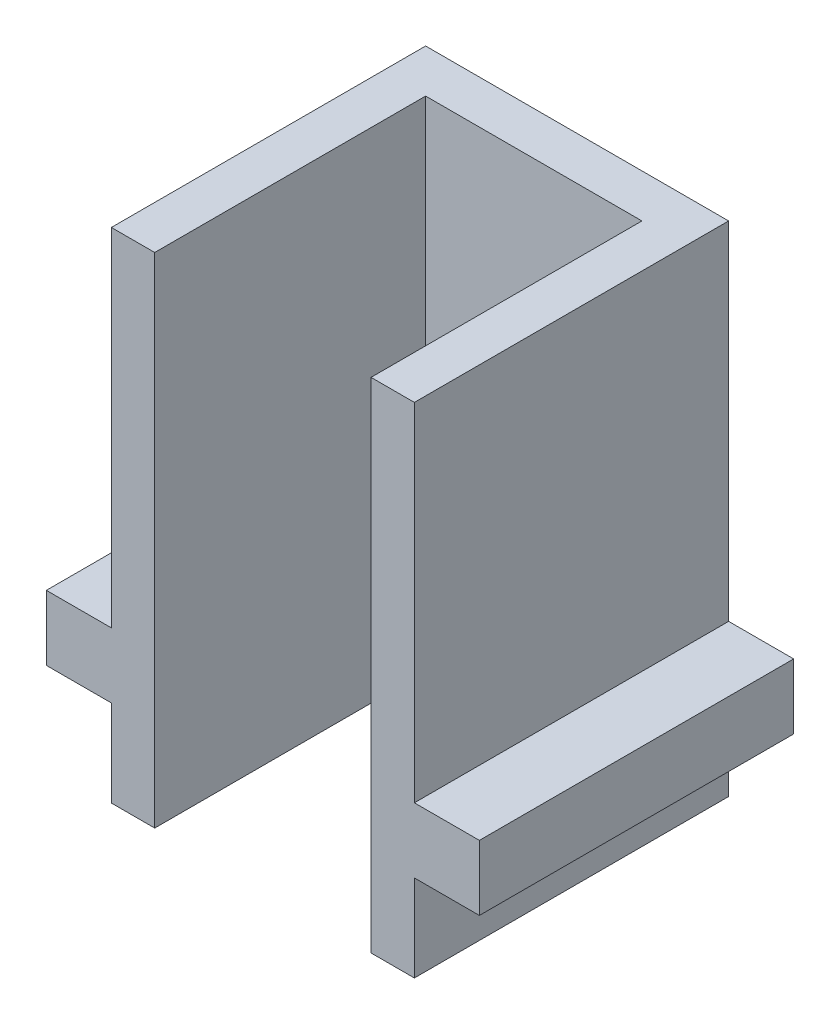
ISO-10303-21;
HEADER;
FILE_DESCRIPTION(('STEP AP214'),'2;1');
FILE_NAME('part.step','',(''),(''),'','','');
FILE_SCHEMA(('AUTOMOTIVE_DESIGN { 1 0 10303 214 1 1 1 1 }'));
ENDSEC;
DATA;
#1=APPLICATION_CONTEXT('core data for automotive mechanical design processes');
#2=APPLICATION_PROTOCOL_DEFINITION('international standard','automotive_design',2000,#1);
#3=PRODUCT_CONTEXT('',#1,'mechanical');
#4=PRODUCT('Part','Part','',(#3));
#5=PRODUCT_RELATED_PRODUCT_CATEGORY('part','',(#4));
#6=PRODUCT_DEFINITION_FORMATION('','',#4);
#7=PRODUCT_DEFINITION_CONTEXT('part definition',#1,'design');
#8=PRODUCT_DEFINITION('design','',#6,#7);
#9=PRODUCT_DEFINITION_SHAPE('','',#8);
#10=(LENGTH_UNIT() NAMED_UNIT(*) SI_UNIT(.MILLI.,.METRE.));
#11=(NAMED_UNIT(*) PLANE_ANGLE_UNIT() SI_UNIT($,.RADIAN.));
#12=(NAMED_UNIT(*) SI_UNIT($,.STERADIAN.) SOLID_ANGLE_UNIT());
#13=UNCERTAINTY_MEASURE_WITH_UNIT(LENGTH_MEASURE(1.E-05),#10,'distance_accuracy_value','');
#14=(GEOMETRIC_REPRESENTATION_CONTEXT(3) GLOBAL_UNCERTAINTY_ASSIGNED_CONTEXT((#13)) GLOBAL_UNIT_ASSIGNED_CONTEXT((#10,
#11,#12)) REPRESENTATION_CONTEXT('',''));
#15=CARTESIAN_POINT('',(0.,0.,0.));
#16=DIRECTION('',(0.,0.,1.));
#17=DIRECTION('',(1.,0.,0.));
#18=AXIS2_PLACEMENT_3D('',#15,#16,#17);
#19=CARTESIAN_POINT('',(6.99000000000001,23.,12.5));
#20=DIRECTION('',(-1.,0.,0.));
#21=DIRECTION('',(0.,0.,1.));
#22=AXIS2_PLACEMENT_3D('',#19,#20,#21);
#23=PLANE('',#22);
#24=DIRECTION('',(0.,-1.,0.));
#25=VECTOR('',#24,1.);
#26=CARTESIAN_POINT('',(6.99000000000001,23.,12.5));
#27=LINE('',#26,#25);
#28=CARTESIAN_POINT('',(6.99000000000001,23.,12.5));
#29=VERTEX_POINT('',#28);
#30=CARTESIAN_POINT('',(6.99000000000001,7.,12.5));
#31=VERTEX_POINT('',#30);
#32=EDGE_CURVE('E262',#29,#31,#27,.T.);
#33=ORIENTED_EDGE('',*,*,#32,.T.);
#34=DIRECTION('',(0.,0.,-1.));
#35=VECTOR('',#34,1.);
#36=CARTESIAN_POINT('',(6.99000000000001,7.,-2.00000000000001));
#37=LINE('',#36,#35);
#38=CARTESIAN_POINT('',(6.99000000000001,7.,-2.00000000000001));
#39=VERTEX_POINT('',#38);
#40=EDGE_CURVE('E175',#31,#39,#37,.T.);
#41=ORIENTED_EDGE('',*,*,#40,.T.);
#42=DIRECTION('',(0.,-1.,0.));
#43=VECTOR('',#42,1.);
#44=CARTESIAN_POINT('',(6.99000000000001,23.,-2.00000000000001));
#45=LINE('',#44,#43);
#46=CARTESIAN_POINT('',(6.99000000000001,23.,-2.00000000000001));
#47=VERTEX_POINT('',#46);
#48=EDGE_CURVE('E261',#47,#39,#45,.T.);
#49=ORIENTED_EDGE('',*,*,#48,.F.);
#50=DIRECTION('',(0.,0.,-1.));
#51=VECTOR('',#50,1.);
#52=CARTESIAN_POINT('',(6.99000000000001,23.,12.5));
#53=LINE('',#52,#51);
#54=EDGE_CURVE('E221',#29,#47,#53,.T.);
#55=ORIENTED_EDGE('',*,*,#54,.F.);
#56=EDGE_LOOP('',(#33,#41,#49,#55));
#57=FACE_BOUND('',#56,.T.);
#58=ADVANCED_FACE('F41',(#57),#23,.F.);
#59=CARTESIAN_POINT('',(-6.99000000000001,23.,-2.));
#60=DIRECTION('',(1.,0.,0.));
#61=DIRECTION('',(0.,0.,-1.));
#62=AXIS2_PLACEMENT_3D('',#59,#60,#61);
#63=PLANE('',#62);
#64=DIRECTION('',(0.,0.,1.));
#65=VECTOR('',#64,1.);
#66=CARTESIAN_POINT('',(-6.99000000000001,4.,-2.));
#67=LINE('',#66,#65);
#68=CARTESIAN_POINT('',(-6.99000000000001,4.,-2.));
#69=VERTEX_POINT('',#68);
#70=CARTESIAN_POINT('',(-6.99,4.,12.5));
#71=VERTEX_POINT('',#70);
#72=EDGE_CURVE('E61',#69,#71,#67,.T.);
#73=ORIENTED_EDGE('',*,*,#72,.F.);
#74=DIRECTION('',(0.,-1.,0.));
#75=VECTOR('',#74,1.);
#76=CARTESIAN_POINT('',(-6.99000000000001,23.,-2.));
#77=LINE('',#76,#75);
#78=CARTESIAN_POINT('',(-6.99000000000001,0.,-2.));
#79=VERTEX_POINT('',#78);
#80=EDGE_CURVE('E260',#69,#79,#77,.T.);
#81=ORIENTED_EDGE('',*,*,#80,.T.);
#82=DIRECTION('',(0.,0.,1.));
#83=VECTOR('',#82,1.);
#84=CARTESIAN_POINT('',(-6.99000000000001,0.,-2.));
#85=LINE('',#84,#83);
#86=CARTESIAN_POINT('',(-6.99,0.,12.5));
#87=VERTEX_POINT('',#86);
#88=EDGE_CURVE('E250',#79,#87,#85,.T.);
#89=ORIENTED_EDGE('',*,*,#88,.T.);
#90=DIRECTION('',(0.,-1.,0.));
#91=VECTOR('',#90,1.);
#92=CARTESIAN_POINT('',(-6.99,23.,12.5));
#93=LINE('',#92,#91);
#94=EDGE_CURVE('E251',#71,#87,#93,.T.);
#95=ORIENTED_EDGE('',*,*,#94,.F.);
#96=EDGE_LOOP('',(#73,#81,#89,#95));
#97=FACE_BOUND('',#96,.T.);
#98=ADVANCED_FACE('F303',(#97),#63,.F.);
#99=DIRECTION('',(0.,0.,-1.));
#100=VECTOR('',#99,1.);
#101=CARTESIAN_POINT('',(-6.99000000000001,7.,-2.));
#102=LINE('',#101,#100);
#103=CARTESIAN_POINT('',(-6.99,7.,12.5));
#104=VERTEX_POINT('',#103);
#105=CARTESIAN_POINT('',(-6.99000000000001,7.,-2.));
#106=VERTEX_POINT('',#105);
#107=EDGE_CURVE('E161',#104,#106,#102,.T.);
#108=ORIENTED_EDGE('',*,*,#107,.F.);
#109=CARTESIAN_POINT('',(-6.99,23.,12.5));
#110=VERTEX_POINT('',#109);
#111=EDGE_CURVE('E255',#110,#104,#93,.T.);
#112=ORIENTED_EDGE('',*,*,#111,.F.);
#113=DIRECTION('',(0.,0.,1.));
#114=VECTOR('',#113,1.);
#115=CARTESIAN_POINT('',(-6.99000000000001,23.,-2.));
#116=LINE('',#115,#114);
#117=CARTESIAN_POINT('',(-6.99000000000001,23.,-2.));
#118=VERTEX_POINT('',#117);
#119=EDGE_CURVE('E229',#118,#110,#116,.T.);
#120=ORIENTED_EDGE('',*,*,#119,.F.);
#121=EDGE_CURVE('E256',#118,#106,#77,.T.);
#122=ORIENTED_EDGE('',*,*,#121,.T.);
#123=EDGE_LOOP('',(#108,#112,#120,#122));
#124=FACE_BOUND('',#123,.T.);
#125=ADVANCED_FACE('F325',(#124),#63,.F.);
#126=CARTESIAN_POINT('',(-4.99,23.,12.5));
#127=DIRECTION('',(-1.,0.,0.));
#128=DIRECTION('',(0.,0.,1.));
#129=AXIS2_PLACEMENT_3D('',#126,#127,#128);
#130=PLANE('',#129);
#131=DIRECTION('',(0.,0.,-1.));
#132=VECTOR('',#131,1.);
#133=CARTESIAN_POINT('',(-4.99,0.,12.5));
#134=LINE('',#133,#132);
#135=CARTESIAN_POINT('',(-4.99,0.,12.5));
#136=VERTEX_POINT('',#135);
#137=CARTESIAN_POINT('',(-4.99,0.,0.));
#138=VERTEX_POINT('',#137);
#139=EDGE_CURVE('E213',#136,#138,#134,.T.);
#140=ORIENTED_EDGE('',*,*,#139,.T.);
#141=DIRECTION('',(0.,-1.,0.));
#142=VECTOR('',#141,1.);
#143=CARTESIAN_POINT('',(-4.99,23.,0.));
#144=LINE('',#143,#142);
#145=CARTESIAN_POINT('',(-4.99,23.,0.));
#146=VERTEX_POINT('',#145);
#147=EDGE_CURVE('E11',#146,#138,#144,.T.);
#148=ORIENTED_EDGE('',*,*,#147,.F.);
#149=DIRECTION('',(0.,0.,-1.));
#150=VECTOR('',#149,1.);
#151=CARTESIAN_POINT('',(-4.99,23.,12.5));
#152=LINE('',#151,#150);
#153=CARTESIAN_POINT('',(-4.99,23.,12.5));
#154=VERTEX_POINT('',#153);
#155=EDGE_CURVE('E212',#154,#146,#152,.T.);
#156=ORIENTED_EDGE('',*,*,#155,.F.);
#157=DIRECTION('',(0.,-1.,0.));
#158=VECTOR('',#157,1.);
#159=CARTESIAN_POINT('',(-4.99,23.,12.5));
#160=LINE('',#159,#158);
#161=EDGE_CURVE('E235',#154,#136,#160,.T.);
#162=ORIENTED_EDGE('',*,*,#161,.T.);
#163=EDGE_LOOP('',(#140,#148,#156,#162));
#164=FACE_BOUND('',#163,.T.);
#165=ADVANCED_FACE('F43',(#164),#130,.F.);
#166=CARTESIAN_POINT('',(-4.99,23.,0.));
#167=DIRECTION('',(0.,0.,-1.));
#168=DIRECTION('',(-1.,0.,0.));
#169=AXIS2_PLACEMENT_3D('',#166,#167,#168);
#170=PLANE('',#169);
#171=DIRECTION('',(1.,0.,0.));
#172=VECTOR('',#171,1.);
#173=CARTESIAN_POINT('',(-4.99,0.,0.));
#174=LINE('',#173,#172);
#175=CARTESIAN_POINT('',(4.99,0.,0.));
#176=VERTEX_POINT('',#175);
#177=EDGE_CURVE('E232',#138,#176,#174,.T.);
#178=ORIENTED_EDGE('',*,*,#177,.T.);
#179=DIRECTION('',(0.,-1.,0.));
#180=VECTOR('',#179,1.);
#181=CARTESIAN_POINT('',(4.99,23.,0.));
#182=LINE('',#181,#180);
#183=CARTESIAN_POINT('',(4.99,23.,0.));
#184=VERTEX_POINT('',#183);
#185=EDGE_CURVE('E47',#184,#176,#182,.T.);
#186=ORIENTED_EDGE('',*,*,#185,.F.);
#187=DIRECTION('',(1.,0.,0.));
#188=VECTOR('',#187,1.);
#189=CARTESIAN_POINT('',(-4.99,23.,0.));
#190=LINE('',#189,#188);
#191=EDGE_CURVE('E220',#146,#184,#190,.T.);
#192=ORIENTED_EDGE('',*,*,#191,.F.);
#193=ORIENTED_EDGE('',*,*,#147,.T.);
#194=EDGE_LOOP('',(#178,#186,#192,#193));
#195=FACE_BOUND('',#194,.T.);
#196=ADVANCED_FACE('F292',(#195),#170,.F.);
#197=CARTESIAN_POINT('',(4.99,23.,0.));
#198=DIRECTION('',(1.,0.,0.));
#199=DIRECTION('',(0.,0.,-1.));
#200=AXIS2_PLACEMENT_3D('',#197,#198,#199);
#201=PLANE('',#200);
#202=DIRECTION('',(0.,0.,1.));
#203=VECTOR('',#202,1.);
#204=CARTESIAN_POINT('',(4.99,0.,0.));
#205=LINE('',#204,#203);
#206=CARTESIAN_POINT('',(4.99000000000001,0.,12.5));
#207=VERTEX_POINT('',#206);
#208=EDGE_CURVE('E240',#176,#207,#205,.T.);
#209=ORIENTED_EDGE('',*,*,#208,.T.);
#210=DIRECTION('',(0.,-1.,0.));
#211=VECTOR('',#210,1.);
#212=CARTESIAN_POINT('',(4.99000000000001,23.,12.5));
#213=LINE('',#212,#211);
#214=CARTESIAN_POINT('',(4.99000000000001,23.,12.5));
#215=VERTEX_POINT('',#214);
#216=EDGE_CURVE('E270',#215,#207,#213,.T.);
#217=ORIENTED_EDGE('',*,*,#216,.F.);
#218=DIRECTION('',(0.,0.,1.));
#219=VECTOR('',#218,1.);
#220=CARTESIAN_POINT('',(4.99,23.,0.));
#221=LINE('',#220,#219);
#222=EDGE_CURVE('E219',#184,#215,#221,.T.);
#223=ORIENTED_EDGE('',*,*,#222,.F.);
#224=ORIENTED_EDGE('',*,*,#185,.T.);
#225=EDGE_LOOP('',(#209,#217,#223,#224));
#226=FACE_BOUND('',#225,.T.);
#227=ADVANCED_FACE('F273',(#226),#201,.F.);
#228=CARTESIAN_POINT('',(4.99000000000001,23.,12.5));
#229=DIRECTION('',(0.,0.,-1.));
#230=DIRECTION('',(-1.,0.,0.));
#231=AXIS2_PLACEMENT_3D('',#228,#229,#230);
#232=PLANE('',#231);
#233=DIRECTION('',(1.,0.,0.));
#234=VECTOR('',#233,1.);
#235=CARTESIAN_POINT('',(4.99000000000001,0.,12.5));
#236=LINE('',#235,#234);
#237=CARTESIAN_POINT('',(6.99000000000001,0.,12.5));
#238=VERTEX_POINT('',#237);
#239=EDGE_CURVE('E239',#207,#238,#236,.T.);
#240=ORIENTED_EDGE('',*,*,#239,.T.);
#241=CARTESIAN_POINT('',(6.99000000000001,4.,12.5));
#242=VERTEX_POINT('',#241);
#243=EDGE_CURVE('E159',#242,#238,#27,.T.);
#244=ORIENTED_EDGE('',*,*,#243,.F.);
#245=DIRECTION('',(-1.,0.,0.));
#246=VECTOR('',#245,1.);
#247=CARTESIAN_POINT('',(9.99000000000001,4.,12.5));
#248=LINE('',#247,#246);
#249=CARTESIAN_POINT('',(9.99000000000001,4.,12.5));
#250=VERTEX_POINT('',#249);
#251=EDGE_CURVE('E57',#250,#242,#248,.T.);
#252=ORIENTED_EDGE('',*,*,#251,.F.);
#253=DIRECTION('',(0.,1.,0.));
#254=VECTOR('',#253,1.);
#255=CARTESIAN_POINT('',(9.99000000000001,7.,12.5));
#256=LINE('',#255,#254);
#257=CARTESIAN_POINT('',(9.99000000000001,7.,12.5));
#258=VERTEX_POINT('',#257);
#259=EDGE_CURVE('E158',#250,#258,#256,.T.);
#260=ORIENTED_EDGE('',*,*,#259,.T.);
#261=DIRECTION('',(-1.,0.,0.));
#262=VECTOR('',#261,1.);
#263=CARTESIAN_POINT('',(9.99000000000001,7.,12.5));
#264=LINE('',#263,#262);
#265=EDGE_CURVE('E177',#258,#31,#264,.T.);
#266=ORIENTED_EDGE('',*,*,#265,.T.);
#267=ORIENTED_EDGE('',*,*,#32,.F.);
#268=DIRECTION('',(1.,0.,0.));
#269=VECTOR('',#268,1.);
#270=CARTESIAN_POINT('',(4.99000000000001,23.,12.5));
#271=LINE('',#270,#269);
#272=EDGE_CURVE('E225',#215,#29,#271,.T.);
#273=ORIENTED_EDGE('',*,*,#272,.F.);
#274=ORIENTED_EDGE('',*,*,#216,.T.);
#275=EDGE_LOOP('',(#240,#244,#252,#260,#266,#267,#273,#274));
#276=FACE_BOUND('',#275,.T.);
#277=ADVANCED_FACE('F160',(#276),#232,.F.);
#278=CARTESIAN_POINT('',(6.99000000000001,4.,-2.00000000000001));
#279=VERTEX_POINT('',#278);
#280=CARTESIAN_POINT('',(6.99000000000001,0.,-2.00000000000001));
#281=VERTEX_POINT('',#280);
#282=EDGE_CURVE('E257',#279,#281,#45,.T.);
#283=ORIENTED_EDGE('',*,*,#282,.F.);
#284=DIRECTION('',(0.,0.,1.));
#285=VECTOR('',#284,1.);
#286=CARTESIAN_POINT('',(6.99000000000001,4.,-2.00000000000001));
#287=LINE('',#286,#285);
#288=EDGE_CURVE('E182',#279,#242,#287,.T.);
#289=ORIENTED_EDGE('',*,*,#288,.T.);
#290=ORIENTED_EDGE('',*,*,#243,.T.);
#291=DIRECTION('',(0.,0.,-1.));
#292=VECTOR('',#291,1.);
#293=CARTESIAN_POINT('',(6.99000000000001,0.,12.5));
#294=LINE('',#293,#292);
#295=EDGE_CURVE('E242',#238,#281,#294,.T.);
#296=ORIENTED_EDGE('',*,*,#295,.T.);
#297=EDGE_LOOP('',(#283,#289,#290,#296));
#298=FACE_BOUND('',#297,.T.);
#299=ADVANCED_FACE('F307',(#298),#23,.F.);
#300=CARTESIAN_POINT('',(6.99000000000001,23.,-2.00000000000001));
#301=DIRECTION('',(0.,0.,1.));
#302=DIRECTION('',(1.,0.,0.));
#303=AXIS2_PLACEMENT_3D('',#300,#301,#302);
#304=PLANE('',#303);
#305=DIRECTION('',(-1.,0.,0.));
#306=VECTOR('',#305,1.);
#307=CARTESIAN_POINT('',(6.99000000000001,0.,-2.00000000000001));
#308=LINE('',#307,#306);
#309=EDGE_CURVE('E241',#281,#79,#308,.T.);
#310=ORIENTED_EDGE('',*,*,#309,.T.);
#311=ORIENTED_EDGE('',*,*,#80,.F.);
#312=DIRECTION('',(1.,0.,0.));
#313=VECTOR('',#312,1.);
#314=CARTESIAN_POINT('',(-9.99000000000001,4.,-2.));
#315=LINE('',#314,#313);
#316=CARTESIAN_POINT('',(-9.99000000000001,4.,-2.));
#317=VERTEX_POINT('',#316);
#318=EDGE_CURVE('E204',#317,#69,#315,.T.);
#319=ORIENTED_EDGE('',*,*,#318,.F.);
#320=DIRECTION('',(0.,-1.,0.));
#321=VECTOR('',#320,1.);
#322=CARTESIAN_POINT('',(-9.99000000000001,7.,-2.));
#323=LINE('',#322,#321);
#324=CARTESIAN_POINT('',(-9.99000000000001,7.,-2.));
#325=VERTEX_POINT('',#324);
#326=EDGE_CURVE('E194',#325,#317,#323,.T.);
#327=ORIENTED_EDGE('',*,*,#326,.F.);
#328=DIRECTION('',(1.,0.,0.));
#329=VECTOR('',#328,1.);
#330=CARTESIAN_POINT('',(-9.99000000000001,7.,-2.));
#331=LINE('',#330,#329);
#332=EDGE_CURVE('E210',#325,#106,#331,.T.);
#333=ORIENTED_EDGE('',*,*,#332,.T.);
#334=ORIENTED_EDGE('',*,*,#121,.F.);
#335=DIRECTION('',(-1.,0.,0.));
#336=VECTOR('',#335,1.);
#337=CARTESIAN_POINT('',(6.99000000000001,23.,-2.00000000000001));
#338=LINE('',#337,#336);
#339=EDGE_CURVE('E227',#47,#118,#338,.T.);
#340=ORIENTED_EDGE('',*,*,#339,.F.);
#341=ORIENTED_EDGE('',*,*,#48,.T.);
#342=DIRECTION('',(-1.,0.,0.));
#343=VECTOR('',#342,1.);
#344=CARTESIAN_POINT('',(9.99000000000001,7.,-2.00000000000001));
#345=LINE('',#344,#343);
#346=CARTESIAN_POINT('',(9.99000000000001,7.,-2.00000000000001));
#347=VERTEX_POINT('',#346);
#348=EDGE_CURVE('E187',#347,#39,#345,.T.);
#349=ORIENTED_EDGE('',*,*,#348,.F.);
#350=DIRECTION('',(0.,-1.,0.));
#351=VECTOR('',#350,1.);
#352=CARTESIAN_POINT('',(9.99000000000001,7.,-2.00000000000001));
#353=LINE('',#352,#351);
#354=CARTESIAN_POINT('',(9.99000000000001,4.,-2.00000000000001));
#355=VERTEX_POINT('',#354);
#356=EDGE_CURVE('E173',#347,#355,#353,.T.);
#357=ORIENTED_EDGE('',*,*,#356,.T.);
#358=DIRECTION('',(-1.,0.,0.));
#359=VECTOR('',#358,1.);
#360=CARTESIAN_POINT('',(9.99000000000001,4.,-2.00000000000001));
#361=LINE('',#360,#359);
#362=EDGE_CURVE('E165',#355,#279,#361,.T.);
#363=ORIENTED_EDGE('',*,*,#362,.T.);
#364=ORIENTED_EDGE('',*,*,#282,.T.);
#365=EDGE_LOOP('',(#310,#311,#319,#327,#333,#334,#340,#341,#349,#357,#363,#364));
#366=FACE_BOUND('',#365,.T.);
#367=ADVANCED_FACE('F304',(#366),#304,.F.);
#368=CARTESIAN_POINT('',(-6.99,23.,12.5));
#369=DIRECTION('',(0.,0.,-1.));
#370=DIRECTION('',(-1.,0.,0.));
#371=AXIS2_PLACEMENT_3D('',#368,#369,#370);
#372=PLANE('',#371);
#373=DIRECTION('',(1.,0.,0.));
#374=VECTOR('',#373,1.);
#375=CARTESIAN_POINT('',(-6.99,0.,12.5));
#376=LINE('',#375,#374);
#377=EDGE_CURVE('E217',#87,#136,#376,.T.);
#378=ORIENTED_EDGE('',*,*,#377,.T.);
#379=ORIENTED_EDGE('',*,*,#161,.F.);
#380=DIRECTION('',(1.,0.,0.));
#381=VECTOR('',#380,1.);
#382=CARTESIAN_POINT('',(-6.99,23.,12.5));
#383=LINE('',#382,#381);
#384=EDGE_CURVE('E228',#110,#154,#383,.T.);
#385=ORIENTED_EDGE('',*,*,#384,.F.);
#386=ORIENTED_EDGE('',*,*,#111,.T.);
#387=DIRECTION('',(1.,0.,0.));
#388=VECTOR('',#387,1.);
#389=CARTESIAN_POINT('',(-9.99,7.,12.5));
#390=LINE('',#389,#388);
#391=CARTESIAN_POINT('',(-9.99,7.,12.5));
#392=VERTEX_POINT('',#391);
#393=EDGE_CURVE('E209',#392,#104,#390,.T.);
#394=ORIENTED_EDGE('',*,*,#393,.F.);
#395=DIRECTION('',(0.,1.,0.));
#396=VECTOR('',#395,1.);
#397=CARTESIAN_POINT('',(-9.99,7.,12.5));
#398=LINE('',#397,#396);
#399=CARTESIAN_POINT('',(-9.99,4.,12.5));
#400=VERTEX_POINT('',#399);
#401=EDGE_CURVE('E186',#400,#392,#398,.T.);
#402=ORIENTED_EDGE('',*,*,#401,.F.);
#403=DIRECTION('',(1.,0.,0.));
#404=VECTOR('',#403,1.);
#405=CARTESIAN_POINT('',(-9.99,4.,12.5));
#406=LINE('',#405,#404);
#407=EDGE_CURVE('E196',#400,#71,#406,.T.);
#408=ORIENTED_EDGE('',*,*,#407,.T.);
#409=ORIENTED_EDGE('',*,*,#94,.T.);
#410=EDGE_LOOP('',(#378,#379,#385,#386,#394,#402,#408,#409));
#411=FACE_BOUND('',#410,.T.);
#412=ADVANCED_FACE('F300',(#411),#372,.F.);
#413=CARTESIAN_POINT('',(0.,23.,0.));
#414=DIRECTION('',(0.,-1.,0.));
#415=DIRECTION('',(0.,0.,-1.));
#416=AXIS2_PLACEMENT_3D('',#413,#414,#415);
#417=PLANE('',#416);
#418=ORIENTED_EDGE('',*,*,#155,.T.);
#419=ORIENTED_EDGE('',*,*,#191,.T.);
#420=ORIENTED_EDGE('',*,*,#222,.T.);
#421=ORIENTED_EDGE('',*,*,#272,.T.);
#422=ORIENTED_EDGE('',*,*,#54,.T.);
#423=ORIENTED_EDGE('',*,*,#339,.T.);
#424=ORIENTED_EDGE('',*,*,#119,.T.);
#425=ORIENTED_EDGE('',*,*,#384,.T.);
#426=EDGE_LOOP('',(#418,#419,#420,#421,#422,#423,#424,#425));
#427=FACE_BOUND('',#426,.T.);
#428=ADVANCED_FACE('F290',(#427),#417,.F.);
#429=CARTESIAN_POINT('',(0.,0.,0.));
#430=DIRECTION('',(0.,-1.,0.));
#431=DIRECTION('',(0.,0.,-1.));
#432=AXIS2_PLACEMENT_3D('',#429,#430,#431);
#433=PLANE('',#432);
#434=ORIENTED_EDGE('',*,*,#139,.F.);
#435=ORIENTED_EDGE('',*,*,#377,.F.);
#436=ORIENTED_EDGE('',*,*,#88,.F.);
#437=ORIENTED_EDGE('',*,*,#309,.F.);
#438=ORIENTED_EDGE('',*,*,#295,.F.);
#439=ORIENTED_EDGE('',*,*,#239,.F.);
#440=ORIENTED_EDGE('',*,*,#208,.F.);
#441=ORIENTED_EDGE('',*,*,#177,.F.);
#442=EDGE_LOOP('',(#434,#435,#436,#437,#438,#439,#440,#441));
#443=FACE_BOUND('',#442,.T.);
#444=ADVANCED_FACE('F278',(#443),#433,.T.);
#445=CARTESIAN_POINT('',(-9.99000000000001,7.,-2.));
#446=DIRECTION('',(0.,-1.,0.));
#447=DIRECTION('',(0.,0.,-1.));
#448=AXIS2_PLACEMENT_3D('',#445,#446,#447);
#449=PLANE('',#448);
#450=ORIENTED_EDGE('',*,*,#107,.T.);
#451=ORIENTED_EDGE('',*,*,#332,.F.);
#452=DIRECTION('',(0.,0.,-1.));
#453=VECTOR('',#452,1.);
#454=CARTESIAN_POINT('',(-9.99000000000001,7.,-2.));
#455=LINE('',#454,#453);
#456=EDGE_CURVE('E195',#392,#325,#455,.T.);
#457=ORIENTED_EDGE('',*,*,#456,.F.);
#458=ORIENTED_EDGE('',*,*,#393,.T.);
#459=EDGE_LOOP('',(#450,#451,#457,#458));
#460=FACE_BOUND('',#459,.T.);
#461=ADVANCED_FACE('F335',(#460),#449,.F.);
#462=CARTESIAN_POINT('',(-9.99000000000001,4.,-2.));
#463=DIRECTION('',(0.,1.,0.));
#464=DIRECTION('',(0.,0.,1.));
#465=AXIS2_PLACEMENT_3D('',#462,#463,#464);
#466=PLANE('',#465);
#467=ORIENTED_EDGE('',*,*,#72,.T.);
#468=ORIENTED_EDGE('',*,*,#407,.F.);
#469=DIRECTION('',(0.,0.,1.));
#470=VECTOR('',#469,1.);
#471=CARTESIAN_POINT('',(-9.99000000000001,4.,-2.));
#472=LINE('',#471,#470);
#473=EDGE_CURVE('E198',#317,#400,#472,.T.);
#474=ORIENTED_EDGE('',*,*,#473,.F.);
#475=ORIENTED_EDGE('',*,*,#318,.T.);
#476=EDGE_LOOP('',(#467,#468,#474,#475));
#477=FACE_BOUND('',#476,.T.);
#478=ADVANCED_FACE('F336',(#477),#466,.F.);
#479=CARTESIAN_POINT('',(-9.99000000000001,0.,0.));
#480=DIRECTION('',(-1.,0.,0.));
#481=DIRECTION('',(0.,0.,1.));
#482=AXIS2_PLACEMENT_3D('',#479,#480,#481);
#483=PLANE('',#482);
#484=ORIENTED_EDGE('',*,*,#401,.T.);
#485=ORIENTED_EDGE('',*,*,#456,.T.);
#486=ORIENTED_EDGE('',*,*,#326,.T.);
#487=ORIENTED_EDGE('',*,*,#473,.T.);
#488=EDGE_LOOP('',(#484,#485,#486,#487));
#489=FACE_BOUND('',#488,.T.);
#490=ADVANCED_FACE('F337',(#489),#483,.T.);
#491=CARTESIAN_POINT('',(9.99000000000001,4.,-2.00000000000001));
#492=DIRECTION('',(0.,-1.,0.));
#493=DIRECTION('',(0.,0.,-1.));
#494=AXIS2_PLACEMENT_3D('',#491,#492,#493);
#495=PLANE('',#494);
#496=ORIENTED_EDGE('',*,*,#288,.F.);
#497=ORIENTED_EDGE('',*,*,#362,.F.);
#498=DIRECTION('',(0.,0.,1.));
#499=VECTOR('',#498,1.);
#500=CARTESIAN_POINT('',(9.99000000000001,4.,-2.00000000000001));
#501=LINE('',#500,#499);
#502=EDGE_CURVE('E169',#355,#250,#501,.T.);
#503=ORIENTED_EDGE('',*,*,#502,.T.);
#504=ORIENTED_EDGE('',*,*,#251,.T.);
#505=EDGE_LOOP('',(#496,#497,#503,#504));
#506=FACE_BOUND('',#505,.T.);
#507=ADVANCED_FACE('F171',(#506),#495,.T.);
#508=CARTESIAN_POINT('',(9.99000000000001,7.,-2.00000000000001));
#509=DIRECTION('',(0.,1.,0.));
#510=DIRECTION('',(0.,0.,1.));
#511=AXIS2_PLACEMENT_3D('',#508,#509,#510);
#512=PLANE('',#511);
#513=ORIENTED_EDGE('',*,*,#40,.F.);
#514=ORIENTED_EDGE('',*,*,#265,.F.);
#515=DIRECTION('',(0.,0.,-1.));
#516=VECTOR('',#515,1.);
#517=CARTESIAN_POINT('',(9.99000000000001,7.,-2.00000000000001));
#518=LINE('',#517,#516);
#519=EDGE_CURVE('E172',#258,#347,#518,.T.);
#520=ORIENTED_EDGE('',*,*,#519,.T.);
#521=ORIENTED_EDGE('',*,*,#348,.T.);
#522=EDGE_LOOP('',(#513,#514,#520,#521));
#523=FACE_BOUND('',#522,.T.);
#524=ADVANCED_FACE('F410',(#523),#512,.T.);
#525=CARTESIAN_POINT('',(9.99000000000001,0.,0.));
#526=DIRECTION('',(1.,0.,0.));
#527=DIRECTION('',(0.,0.,1.));
#528=AXIS2_PLACEMENT_3D('',#525,#526,#527);
#529=PLANE('',#528);
#530=ORIENTED_EDGE('',*,*,#259,.F.);
#531=ORIENTED_EDGE('',*,*,#502,.F.);
#532=ORIENTED_EDGE('',*,*,#356,.F.);
#533=ORIENTED_EDGE('',*,*,#519,.F.);
#534=EDGE_LOOP('',(#530,#531,#532,#533));
#535=FACE_BOUND('',#534,.T.);
#536=ADVANCED_FACE('F167',(#535),#529,.T.);
#537=CLOSED_SHELL('',(#58,#98,#125,#165,#196,#227,#277,#299,#367,#412,#428,#444,#461,#478,#490,
#507,#524,#536));
#538=MANIFOLD_SOLID_BREP('B2',#537);
#539=ADVANCED_BREP_SHAPE_REPRESENTATION('',(#18,#538),#14);
#540=SHAPE_DEFINITION_REPRESENTATION(#9,#539);
ENDSEC;
END-ISO-10303-21;
